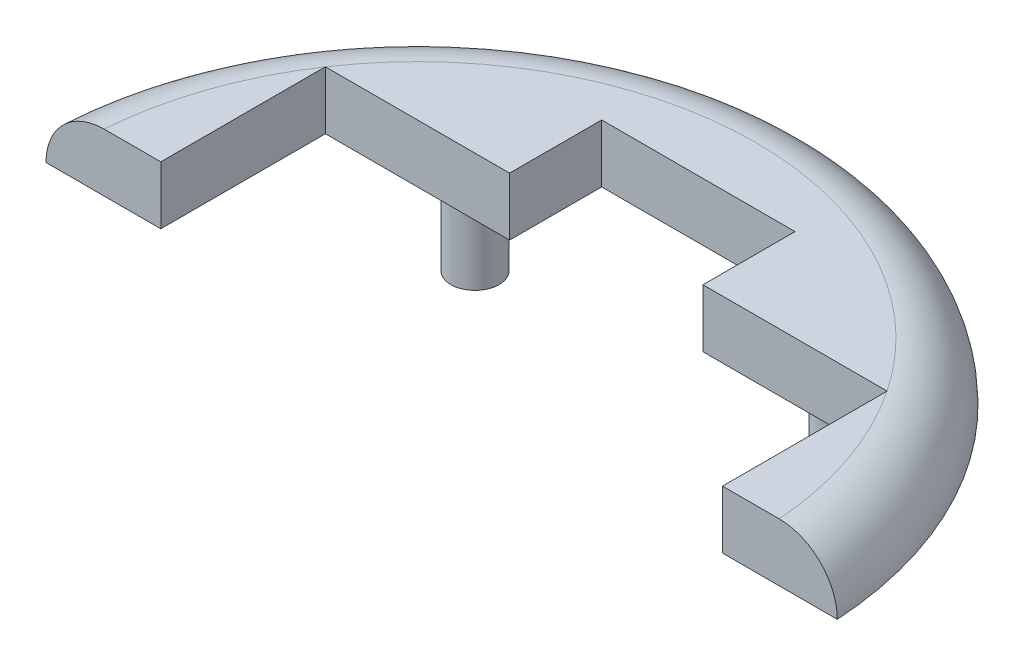
ISO-10303-21;
HEADER;
FILE_DESCRIPTION(('STEP AP214'),'2;1');
FILE_NAME('part.step','',(''),(''),'','','');
FILE_SCHEMA(('AUTOMOTIVE_DESIGN { 1 0 10303 214 1 1 1 1 }'));
ENDSEC;
DATA;
#1=APPLICATION_CONTEXT('core data for automotive mechanical design processes');
#2=APPLICATION_PROTOCOL_DEFINITION('international standard','automotive_design',2000,#1);
#3=PRODUCT_CONTEXT('',#1,'mechanical');
#4=PRODUCT('Part','Part','',(#3));
#5=PRODUCT_RELATED_PRODUCT_CATEGORY('part','',(#4));
#6=PRODUCT_DEFINITION_FORMATION('','',#4);
#7=PRODUCT_DEFINITION_CONTEXT('part definition',#1,'design');
#8=PRODUCT_DEFINITION('design','',#6,#7);
#9=PRODUCT_DEFINITION_SHAPE('','',#8);
#10=(LENGTH_UNIT() NAMED_UNIT(*) SI_UNIT(.MILLI.,.METRE.));
#11=(NAMED_UNIT(*) PLANE_ANGLE_UNIT() SI_UNIT($,.RADIAN.));
#12=(NAMED_UNIT(*) SI_UNIT($,.STERADIAN.) SOLID_ANGLE_UNIT());
#13=UNCERTAINTY_MEASURE_WITH_UNIT(LENGTH_MEASURE(1.E-05),#10,'distance_accuracy_value','');
#14=(GEOMETRIC_REPRESENTATION_CONTEXT(3) GLOBAL_UNCERTAINTY_ASSIGNED_CONTEXT((#13)) GLOBAL_UNIT_ASSIGNED_CONTEXT((#10,
#11,#12)) REPRESENTATION_CONTEXT('',''));
#15=CARTESIAN_POINT('',(0.,0.,0.));
#16=DIRECTION('',(0.,0.,1.));
#17=DIRECTION('',(1.,0.,0.));
#18=AXIS2_PLACEMENT_3D('',#15,#16,#17);
#19=CARTESIAN_POINT('',(0.,6.,0.));
#20=DIRECTION('',(0.,-1.,0.));
#21=DIRECTION('',(0.,0.,-1.));
#22=AXIS2_PLACEMENT_3D('',#19,#20,#21);
#23=PLANE('',#22);
#24=DIRECTION('',(1.,0.,0.));
#25=VECTOR('',#24,1.);
#26=CARTESIAN_POINT('',(40.9237095092808,6.,-2.5));
#27=LINE('',#26,#25);
#28=CARTESIAN_POINT('',(29.05,6.,-2.5));
#29=VERTEX_POINT('',#28);
#30=CARTESIAN_POINT('',(34.9106001094224,6.,-2.5));
#31=VERTEX_POINT('',#30);
#32=EDGE_CURVE('E168',#29,#31,#27,.T.);
#33=ORIENTED_EDGE('',*,*,#32,.T.);
#34=CARTESIAN_POINT('',(0.,6.,0.));
#35=DIRECTION('',(0.,-1.,0.));
#36=DIRECTION('',(0.,0.,-1.));
#37=AXIS2_PLACEMENT_3D('',#34,#35,#36);
#38=CIRCLE('',#37,35.);
#39=CARTESIAN_POINT('',(29.05,6.,-19.5217186743381));
#40=VERTEX_POINT('',#39);
#41=EDGE_CURVE('E213',#31,#40,#38,.F.);
#42=ORIENTED_EDGE('',*,*,#41,.T.);
#43=DIRECTION('',(0.,0.,1.));
#44=VECTOR('',#43,1.);
#45=CARTESIAN_POINT('',(29.05,6.,-2.5));
#46=LINE('',#45,#44);
#47=EDGE_CURVE('E166',#40,#29,#46,.T.);
#48=ORIENTED_EDGE('',*,*,#47,.T.);
#49=EDGE_LOOP('',(#33,#42,#48));
#50=FACE_BOUND('',#49,.T.);
#51=ADVANCED_FACE('F33',(#50),#23,.F.);
#52=DIRECTION('',(1.,0.,0.));
#53=VECTOR('',#52,1.);
#54=CARTESIAN_POINT('',(29.05,6.,-19.525));
#55=LINE('',#54,#53);
#56=CARTESIAN_POINT('',(10.,6.,-19.525));
#57=VERTEX_POINT('',#56);
#58=CARTESIAN_POINT('',(29.0477946667213,6.,-19.525));
#59=VERTEX_POINT('',#58);
#60=EDGE_CURVE('E163',#57,#59,#55,.T.);
#61=ORIENTED_EDGE('',*,*,#60,.T.);
#62=CARTESIAN_POINT('',(0.,6.,0.));
#63=DIRECTION('',(0.,-1.,0.));
#64=DIRECTION('',(0.,0.,-1.));
#65=AXIS2_PLACEMENT_3D('',#62,#63,#64);
#66=CIRCLE('',#65,35.);
#67=CARTESIAN_POINT('',(-29.0477946667212,6.,-19.525));
#68=VERTEX_POINT('',#67);
#69=EDGE_CURVE('E211',#59,#68,#66,.F.);
#70=ORIENTED_EDGE('',*,*,#69,.T.);
#71=DIRECTION('',(1.,0.,0.));
#72=VECTOR('',#71,1.);
#73=CARTESIAN_POINT('',(-10.,6.,-19.525));
#74=LINE('',#73,#72);
#75=CARTESIAN_POINT('',(-10.,6.,-19.525));
#76=VERTEX_POINT('',#75);
#77=EDGE_CURVE('E149',#68,#76,#74,.T.);
#78=ORIENTED_EDGE('',*,*,#77,.T.);
#79=DIRECTION('',(0.,0.,-1.));
#80=VECTOR('',#79,1.);
#81=CARTESIAN_POINT('',(-10.,6.,-29.05));
#82=LINE('',#81,#80);
#83=CARTESIAN_POINT('',(-10.,6.,-29.05));
#84=VERTEX_POINT('',#83);
#85=EDGE_CURVE('E156',#76,#84,#82,.T.);
#86=ORIENTED_EDGE('',*,*,#85,.T.);
#87=DIRECTION('',(1.,0.,0.));
#88=VECTOR('',#87,1.);
#89=CARTESIAN_POINT('',(10.,6.,-29.05));
#90=LINE('',#89,#88);
#91=CARTESIAN_POINT('',(10.,6.,-29.05));
#92=VERTEX_POINT('',#91);
#93=EDGE_CURVE('E158',#84,#92,#90,.T.);
#94=ORIENTED_EDGE('',*,*,#93,.T.);
#95=DIRECTION('',(0.,0.,1.));
#96=VECTOR('',#95,1.);
#97=CARTESIAN_POINT('',(10.,6.,-19.525));
#98=LINE('',#97,#96);
#99=EDGE_CURVE('E160',#92,#57,#98,.T.);
#100=ORIENTED_EDGE('',*,*,#99,.T.);
#101=EDGE_LOOP('',(#61,#70,#78,#86,#94,#100));
#102=FACE_BOUND('',#101,.T.);
#103=ADVANCED_FACE('F229',(#102),#23,.F.);
#104=CARTESIAN_POINT('',(-40.9237095092808,6.,-2.5));
#105=DIRECTION('',(0.,0.,-1.));
#106=DIRECTION('',(-1.,0.,0.));
#107=AXIS2_PLACEMENT_3D('',#104,#105,#106);
#108=PLANE('',#107);
#109=DIRECTION('',(1.,0.,0.));
#110=VECTOR('',#109,1.);
#111=CARTESIAN_POINT('',(-40.9237095092808,6.,-2.5));
#112=LINE('',#111,#110);
#113=CARTESIAN_POINT('',(-34.9106001094224,6.,-2.5));
#114=VERTEX_POINT('',#113);
#115=CARTESIAN_POINT('',(-29.05,6.,-2.5));
#116=VERTEX_POINT('',#115);
#117=EDGE_CURVE('E126',#114,#116,#112,.T.);
#118=ORIENTED_EDGE('',*,*,#117,.F.);
#119=CARTESIAN_POINT('',(-34.9106001094224,6.,-2.5));
#120=CARTESIAN_POINT('',(-35.0800179882929,6.00001797018295,-2.5));
#121=CARTESIAN_POINT('',(-35.2494336832572,5.9928617550382,-2.5));
#122=CARTESIAN_POINT('',(-35.5870566753661,5.96432730383787,-2.5));
#123=CARTESIAN_POINT('',(-35.7552640202545,5.94294963285177,-2.5));
#124=CARTESIAN_POINT('',(-36.0891672008,5.88611778897676,-2.5));
#125=CARTESIAN_POINT('',(-36.2548646551365,5.85067312777653,-2.5));
#126=CARTESIAN_POINT('',(-36.5826845879187,5.76595916081949,-2.5));
#127=CARTESIAN_POINT('',(-36.7448071169612,5.71669005085946,-2.5));
#128=CARTESIAN_POINT('',(-37.0643807867991,5.60464970885536,-2.5));
#129=CARTESIAN_POINT('',(-37.2218302926284,5.54187381306706,-2.5));
#130=CARTESIAN_POINT('',(-37.5309329973001,5.40324479398387,-2.5));
#131=CARTESIAN_POINT('',(-37.682584039163,5.32738686100436,-2.5));
#132=CARTESIAN_POINT('',(-37.9788608317051,5.16318960253427,-2.5));
#133=CARTESIAN_POINT('',(-38.1234904584548,5.07485727110241,-2.5));
#134=CARTESIAN_POINT('',(-38.4048286621699,4.88626966285092,-2.5));
#135=CARTESIAN_POINT('',(-38.5415344734195,4.78601025985342,-2.5));
#136=CARTESIAN_POINT('',(-38.8057828059783,4.57446840134053,-2.5));
#137=CARTESIAN_POINT('',(-38.9333393018911,4.46320340207344,-2.5));
#138=CARTESIAN_POINT('',(-39.1786092340384,4.23030748175573,-2.5));
#139=CARTESIAN_POINT('',(-39.2963226900089,4.10867658149048,-2.5));
#140=CARTESIAN_POINT('',(-39.5211033872014,3.85586455977837,-2.5));
#141=CARTESIAN_POINT('',(-39.6281666564116,3.7246799065966,-2.5));
#142=CARTESIAN_POINT('',(-39.8307912334343,3.45378132041483,-2.5));
#143=CARTESIAN_POINT('',(-39.9263565546816,3.31407038938447,-2.5));
#144=CARTESIAN_POINT('',(-40.1052030753096,3.02729301078446,-2.5));
#145=CARTESIAN_POINT('',(-40.1885028955557,2.88023817657385,-2.5));
#146=CARTESIAN_POINT('',(-40.342365783475,2.57967940741662,-2.5));
#147=CARTESIAN_POINT('',(-40.412933510642,2.4261778571957,-2.5));
#148=CARTESIAN_POINT('',(-40.5408429805404,2.11380871838092,-2.5));
#149=CARTESIAN_POINT('',(-40.5981887980583,1.95494280035191,-2.5));
#150=CARTESIAN_POINT('',(-40.6992549642066,1.63300078138544,-2.5));
#151=CARTESIAN_POINT('',(-40.7429786589001,1.46992572503149,-2.5));
#152=CARTESIAN_POINT('',(-40.8275657490682,1.09108137200387,-2.5));
#153=CARTESIAN_POINT('',(-40.8636185671392,0.874207524943266,-2.5));
#154=CARTESIAN_POINT('',(-40.8996689724679,0.547183080580897,-2.5));
#155=CARTESIAN_POINT('',(-40.9086809625199,0.437945385181208,-2.5));
#156=CARTESIAN_POINT('',(-40.9207005327296,0.219147244824673,-2.5));
#157=CARTESIAN_POINT('',(-40.9237085035704,0.109586821332472,-2.5));
#158=CARTESIAN_POINT('',(-40.9237095092808,0.,-2.5));
#159=B_SPLINE_CURVE_WITH_KNOTS('',3,(#119,#120,#121,#122,#123,#124,#125,#126,#127,#128,#129,
#130,#131,#132,#133,#134,#135,#136,#137,#138,#139,#140,#141,#142,#143,#144,#145,#146,#147,#148,
#149,#150,#151,#152,#153,#154,#155,#156,#157,#158),.UNSPECIFIED.,.F.,.F.,(4,2,2,2,2,2,2,2,2,2,2,
2,2,2,2,2,2,2,2,4),(0.,0.508099525865794,1.01617886431956,1.52391523806421,2.03164442106037,
2.53954919949851,3.04764111164478,3.55544927308924,4.06343362477902,4.57062479067096,
5.07781493958412,5.58519354257388,6.0923945247053,6.59881738005688,7.10505452503779,
7.61113544645497,8.11709195875391,8.77513696185111,9.10382486325526,9.43249137614971),.UNSPECIFIED.);
#160=CARTESIAN_POINT('',(-40.9237095092808,0.,-2.5));
#161=VERTEX_POINT('',#160);
#162=EDGE_CURVE('E215',#114,#161,#159,.T.);
#163=ORIENTED_EDGE('',*,*,#162,.T.);
#164=DIRECTION('',(1.,0.,0.));
#165=VECTOR('',#164,1.);
#166=CARTESIAN_POINT('',(-40.9237095092808,0.,-2.5));
#167=LINE('',#166,#165);
#168=CARTESIAN_POINT('',(-29.05,0.,-2.5));
#169=VERTEX_POINT('',#168);
#170=EDGE_CURVE('E142',#161,#169,#167,.T.);
#171=ORIENTED_EDGE('',*,*,#170,.T.);
#172=DIRECTION('',(0.,-1.,0.));
#173=VECTOR('',#172,1.);
#174=CARTESIAN_POINT('',(-29.05,6.,-2.5));
#175=LINE('',#174,#173);
#176=EDGE_CURVE('E139',#116,#169,#175,.T.);
#177=ORIENTED_EDGE('',*,*,#176,.F.);
#178=EDGE_LOOP('',(#118,#163,#171,#177));
#179=FACE_BOUND('',#178,.T.);
#180=ADVANCED_FACE('F140',(#179),#108,.F.);
#181=CARTESIAN_POINT('',(-29.05,6.,-19.525));
#182=DIRECTION('',(-1.,0.,0.));
#183=DIRECTION('',(0.,0.,1.));
#184=AXIS2_PLACEMENT_3D('',#181,#182,#183);
#185=PLANE('',#184);
#186=DIRECTION('',(0.,0.,-1.));
#187=VECTOR('',#186,1.);
#188=CARTESIAN_POINT('',(-29.05,0.,-19.525));
#189=LINE('',#188,#187);
#190=CARTESIAN_POINT('',(-29.05,0.,-19.525));
#191=VERTEX_POINT('',#190);
#192=EDGE_CURVE('E176',#169,#191,#189,.T.);
#193=ORIENTED_EDGE('',*,*,#192,.T.);
#194=DIRECTION('',(0.,-1.,0.));
#195=VECTOR('',#194,1.);
#196=CARTESIAN_POINT('',(-29.05,6.,-19.525));
#197=LINE('',#196,#195);
#198=CARTESIAN_POINT('',(-29.05,6.,-19.525));
#199=VERTEX_POINT('',#198);
#200=EDGE_CURVE('E145',#199,#191,#197,.T.);
#201=ORIENTED_EDGE('',*,*,#200,.F.);
#202=DIRECTION('',(0.,0.,-1.));
#203=VECTOR('',#202,1.);
#204=CARTESIAN_POINT('',(-29.05,6.,-19.525));
#205=LINE('',#204,#203);
#206=CARTESIAN_POINT('',(-29.05,6.,-19.5217186743381));
#207=VERTEX_POINT('',#206);
#208=EDGE_CURVE('E135',#207,#199,#205,.T.);
#209=ORIENTED_EDGE('',*,*,#208,.F.);
#210=EDGE_CURVE('E130',#116,#207,#205,.T.);
#211=ORIENTED_EDGE('',*,*,#210,.F.);
#212=ORIENTED_EDGE('',*,*,#176,.T.);
#213=EDGE_LOOP('',(#193,#201,#209,#211,#212));
#214=FACE_BOUND('',#213,.T.);
#215=ADVANCED_FACE('F147',(#214),#185,.F.);
#216=CARTESIAN_POINT('',(-10.,6.,-19.525));
#217=DIRECTION('',(0.,0.,-1.));
#218=DIRECTION('',(-1.,0.,0.));
#219=AXIS2_PLACEMENT_3D('',#216,#217,#218);
#220=PLANE('',#219);
#221=DIRECTION('',(1.,0.,0.));
#222=VECTOR('',#221,1.);
#223=CARTESIAN_POINT('',(-10.,0.,-19.525));
#224=LINE('',#223,#222);
#225=CARTESIAN_POINT('',(-10.,0.,-19.525));
#226=VERTEX_POINT('',#225);
#227=EDGE_CURVE('E178',#191,#226,#224,.T.);
#228=ORIENTED_EDGE('',*,*,#227,.T.);
#229=DIRECTION('',(0.,-1.,0.));
#230=VECTOR('',#229,1.);
#231=CARTESIAN_POINT('',(-10.,6.,-19.525));
#232=LINE('',#231,#230);
#233=EDGE_CURVE('E205',#76,#226,#232,.T.);
#234=ORIENTED_EDGE('',*,*,#233,.F.);
#235=ORIENTED_EDGE('',*,*,#77,.F.);
#236=EDGE_CURVE('E151',#199,#68,#74,.T.);
#237=ORIENTED_EDGE('',*,*,#236,.F.);
#238=ORIENTED_EDGE('',*,*,#200,.T.);
#239=EDGE_LOOP('',(#228,#234,#235,#237,#238));
#240=FACE_BOUND('',#239,.T.);
#241=ADVANCED_FACE('F232',(#240),#220,.F.);
#242=CARTESIAN_POINT('',(-10.,6.,-29.05));
#243=DIRECTION('',(-1.,0.,0.));
#244=DIRECTION('',(0.,0.,1.));
#245=AXIS2_PLACEMENT_3D('',#242,#243,#244);
#246=PLANE('',#245);
#247=DIRECTION('',(0.,0.,-1.));
#248=VECTOR('',#247,1.);
#249=CARTESIAN_POINT('',(-10.,0.,-29.05));
#250=LINE('',#249,#248);
#251=CARTESIAN_POINT('',(-10.,0.,-29.05));
#252=VERTEX_POINT('',#251);
#253=EDGE_CURVE('E180',#226,#252,#250,.T.);
#254=ORIENTED_EDGE('',*,*,#253,.T.);
#255=DIRECTION('',(0.,-1.,0.));
#256=VECTOR('',#255,1.);
#257=CARTESIAN_POINT('',(-10.,6.,-29.05));
#258=LINE('',#257,#256);
#259=EDGE_CURVE('E202',#84,#252,#258,.T.);
#260=ORIENTED_EDGE('',*,*,#259,.F.);
#261=ORIENTED_EDGE('',*,*,#85,.F.);
#262=ORIENTED_EDGE('',*,*,#233,.T.);
#263=EDGE_LOOP('',(#254,#260,#261,#262));
#264=FACE_BOUND('',#263,.T.);
#265=ADVANCED_FACE('F235',(#264),#246,.F.);
#266=CARTESIAN_POINT('',(10.,6.,-29.05));
#267=DIRECTION('',(0.,0.,-1.));
#268=DIRECTION('',(-1.,0.,0.));
#269=AXIS2_PLACEMENT_3D('',#266,#267,#268);
#270=PLANE('',#269);
#271=DIRECTION('',(1.,0.,0.));
#272=VECTOR('',#271,1.);
#273=CARTESIAN_POINT('',(10.,0.,-29.05));
#274=LINE('',#273,#272);
#275=CARTESIAN_POINT('',(10.,0.,-29.05));
#276=VERTEX_POINT('',#275);
#277=EDGE_CURVE('E182',#252,#276,#274,.T.);
#278=ORIENTED_EDGE('',*,*,#277,.T.);
#279=DIRECTION('',(0.,-1.,0.));
#280=VECTOR('',#279,1.);
#281=CARTESIAN_POINT('',(10.,6.,-29.05));
#282=LINE('',#281,#280);
#283=EDGE_CURVE('E199',#92,#276,#282,.T.);
#284=ORIENTED_EDGE('',*,*,#283,.F.);
#285=ORIENTED_EDGE('',*,*,#93,.F.);
#286=ORIENTED_EDGE('',*,*,#259,.T.);
#287=EDGE_LOOP('',(#278,#284,#285,#286));
#288=FACE_BOUND('',#287,.T.);
#289=ADVANCED_FACE('F239',(#288),#270,.F.);
#290=CARTESIAN_POINT('',(10.,6.,-19.525));
#291=DIRECTION('',(1.,0.,0.));
#292=DIRECTION('',(0.,0.,-1.));
#293=AXIS2_PLACEMENT_3D('',#290,#291,#292);
#294=PLANE('',#293);
#295=DIRECTION('',(0.,0.,1.));
#296=VECTOR('',#295,1.);
#297=CARTESIAN_POINT('',(10.,0.,-19.525));
#298=LINE('',#297,#296);
#299=CARTESIAN_POINT('',(10.,0.,-19.525));
#300=VERTEX_POINT('',#299);
#301=EDGE_CURVE('E184',#276,#300,#298,.T.);
#302=ORIENTED_EDGE('',*,*,#301,.T.);
#303=DIRECTION('',(0.,-1.,0.));
#304=VECTOR('',#303,1.);
#305=CARTESIAN_POINT('',(10.,6.,-19.525));
#306=LINE('',#305,#304);
#307=EDGE_CURVE('E196',#57,#300,#306,.T.);
#308=ORIENTED_EDGE('',*,*,#307,.F.);
#309=ORIENTED_EDGE('',*,*,#99,.F.);
#310=ORIENTED_EDGE('',*,*,#283,.T.);
#311=EDGE_LOOP('',(#302,#308,#309,#310));
#312=FACE_BOUND('',#311,.T.);
#313=ADVANCED_FACE('F243',(#312),#294,.F.);
#314=CARTESIAN_POINT('',(29.05,6.,-19.525));
#315=DIRECTION('',(0.,0.,-1.));
#316=DIRECTION('',(-1.,0.,0.));
#317=AXIS2_PLACEMENT_3D('',#314,#315,#316);
#318=PLANE('',#317);
#319=DIRECTION('',(1.,0.,0.));
#320=VECTOR('',#319,1.);
#321=CARTESIAN_POINT('',(29.05,0.,-19.525));
#322=LINE('',#321,#320);
#323=CARTESIAN_POINT('',(29.05,0.,-19.525));
#324=VERTEX_POINT('',#323);
#325=EDGE_CURVE('E186',#300,#324,#322,.T.);
#326=ORIENTED_EDGE('',*,*,#325,.T.);
#327=DIRECTION('',(0.,-1.,0.));
#328=VECTOR('',#327,1.);
#329=CARTESIAN_POINT('',(29.05,6.,-19.525));
#330=LINE('',#329,#328);
#331=CARTESIAN_POINT('',(29.05,6.,-19.525));
#332=VERTEX_POINT('',#331);
#333=EDGE_CURVE('E193',#332,#324,#330,.T.);
#334=ORIENTED_EDGE('',*,*,#333,.F.);
#335=EDGE_CURVE('E162',#59,#332,#55,.T.);
#336=ORIENTED_EDGE('',*,*,#335,.F.);
#337=ORIENTED_EDGE('',*,*,#60,.F.);
#338=ORIENTED_EDGE('',*,*,#307,.T.);
#339=EDGE_LOOP('',(#326,#334,#336,#337,#338));
#340=FACE_BOUND('',#339,.T.);
#341=ADVANCED_FACE('F247',(#340),#318,.F.);
#342=CARTESIAN_POINT('',(29.05,6.,-2.5));
#343=DIRECTION('',(1.,0.,0.));
#344=DIRECTION('',(0.,0.,-1.));
#345=AXIS2_PLACEMENT_3D('',#342,#343,#344);
#346=PLANE('',#345);
#347=DIRECTION('',(0.,0.,1.));
#348=VECTOR('',#347,1.);
#349=CARTESIAN_POINT('',(29.05,0.,-2.5));
#350=LINE('',#349,#348);
#351=CARTESIAN_POINT('',(29.05,0.,-2.5));
#352=VERTEX_POINT('',#351);
#353=EDGE_CURVE('E188',#324,#352,#350,.T.);
#354=ORIENTED_EDGE('',*,*,#353,.T.);
#355=DIRECTION('',(0.,-1.,0.));
#356=VECTOR('',#355,1.);
#357=CARTESIAN_POINT('',(29.05,6.,-2.5));
#358=LINE('',#357,#356);
#359=EDGE_CURVE('E170',#29,#352,#358,.T.);
#360=ORIENTED_EDGE('',*,*,#359,.F.);
#361=ORIENTED_EDGE('',*,*,#47,.F.);
#362=EDGE_CURVE('E57',#332,#40,#46,.T.);
#363=ORIENTED_EDGE('',*,*,#362,.F.);
#364=ORIENTED_EDGE('',*,*,#333,.T.);
#365=EDGE_LOOP('',(#354,#360,#361,#363,#364));
#366=FACE_BOUND('',#365,.T.);
#367=ADVANCED_FACE('F251',(#366),#346,.F.);
#368=CARTESIAN_POINT('',(40.9237095092808,6.,-2.5));
#369=DIRECTION('',(0.,0.,-1.));
#370=DIRECTION('',(-1.,0.,0.));
#371=AXIS2_PLACEMENT_3D('',#368,#369,#370);
#372=PLANE('',#371);
#373=DIRECTION('',(1.,0.,0.));
#374=VECTOR('',#373,1.);
#375=CARTESIAN_POINT('',(40.9237095092808,0.,-2.5));
#376=LINE('',#375,#374);
#377=CARTESIAN_POINT('',(40.9237095092808,0.,-2.5));
#378=VERTEX_POINT('',#377);
#379=EDGE_CURVE('E136',#352,#378,#376,.T.);
#380=ORIENTED_EDGE('',*,*,#379,.T.);
#381=CARTESIAN_POINT('',(40.9237095092808,0.,-2.5));
#382=CARTESIAN_POINT('',(40.9237278216039,0.1685178725476,-2.5));
#383=CARTESIAN_POINT('',(40.9165974765413,0.33703304225152,-2.5));
#384=CARTESIAN_POINT('',(40.8881717895351,0.672856156919677,-2.5));
#385=CARTESIAN_POINT('',(40.8668771726662,0.840164163235956,-2.5));
#386=CARTESIAN_POINT('',(40.8102779729104,1.17225521428295,-2.5));
#387=CARTESIAN_POINT('',(40.7749846559244,1.33704017902427,-2.5));
#388=CARTESIAN_POINT('',(40.6906472368231,1.66305058865522,-2.5));
#389=CARTESIAN_POINT('',(40.6416032943122,1.82427607483651,-2.5));
#390=CARTESIAN_POINT('',(40.5300984923907,2.14207047141376,-2.5));
#391=CARTESIAN_POINT('',(40.4676337988165,2.29863803650914,-2.5));
#392=CARTESIAN_POINT('',(40.3297183569953,2.60601440527306,-2.5));
#393=CARTESIAN_POINT('',(40.2542628347779,2.75682106689774,-2.5));
#394=CARTESIAN_POINT('',(40.090964760547,3.0514683601167,-2.5));
#395=CARTESIAN_POINT('',(40.0031287020198,3.19531259065292,-2.5));
#396=CARTESIAN_POINT('',(39.81563497107,3.47515090239466,-2.5));
#397=CARTESIAN_POINT('',(39.7159731944274,3.6111422336956,-2.5));
#398=CARTESIAN_POINT('',(39.5055051026169,3.87433386531818,-2.5));
#399=CARTESIAN_POINT('',(39.3946925605393,4.00152918605468,-2.5));
#400=CARTESIAN_POINT('',(39.1627605333481,4.24614750966031,-2.5));
#401=CARTESIAN_POINT('',(39.041641028659,4.36357049396851,-2.5));
#402=CARTESIAN_POINT('',(38.7899122708075,4.5878582691919,-2.5));
#403=CARTESIAN_POINT('',(38.6592995616403,4.69471918123202,-2.5));
#404=CARTESIAN_POINT('',(38.3896002183965,4.89704804976446,-2.5));
#405=CARTESIAN_POINT('',(38.2505165124172,4.9925199096302,-2.5));
#406=CARTESIAN_POINT('',(37.9644877895384,5.17165379245415,-2.5));
#407=CARTESIAN_POINT('',(37.8175251776501,5.25528772376344,-2.5));
#408=CARTESIAN_POINT('',(37.5171403569025,5.40986560784158,-2.5));
#409=CARTESIAN_POINT('',(37.3637204921865,5.48081411747481,-2.5));
#410=CARTESIAN_POINT('',(37.0514929775787,5.60954676239761,-2.5));
#411=CARTESIAN_POINT('',(36.8926867099983,5.66733424626671,-2.5));
#412=CARTESIAN_POINT('',(36.5708435143871,5.76935141273479,-2.5));
#413=CARTESIAN_POINT('',(36.4078075863269,5.81358426878316,-2.5));
#414=CARTESIAN_POINT('',(36.0246128758776,5.90042786825471,-2.5));
#415=CARTESIAN_POINT('',(35.8032243988928,5.937768407856,-2.5));
#416=CARTESIAN_POINT('',(35.4693385044089,5.97510430920544,-2.5));
#417=CARTESIAN_POINT('',(35.3577992070453,5.98443711789794,-2.5));
#418=CARTESIAN_POINT('',(35.1343826157527,5.99688413465124,-2.5));
#419=CARTESIAN_POINT('',(35.0225053481457,5.99999881509948,-2.5));
#420=CARTESIAN_POINT('',(34.9106001094224,6.,-2.5));
#421=B_SPLINE_CURVE_WITH_KNOTS('',3,(#381,#382,#383,#384,#385,#386,#387,#388,#389,#390,#391,
#392,#393,#394,#395,#396,#397,#398,#399,#400,#401,#402,#403,#404,#405,#406,#407,#408,#409,#410,
#411,#412,#413,#414,#415,#416,#417,#418,#419,#420),.UNSPECIFIED.,.F.,.F.,(4,2,2,2,2,2,2,2,2,2,2,
2,2,2,2,2,2,2,2,4),(0.,0.505399005280253,1.01077214097528,1.51573938405979,2.02070076620141,
2.52580660263348,3.03109845702832,3.53612626953278,4.04132987189454,4.54681717689786,
5.05230544196896,5.55797866097836,6.06347806946794,6.5701576188536,7.07665479124049,
7.58302295046586,8.08927246655055,8.76123117126683,9.096873193572,9.43248971638488),.UNSPECIFIED.);
#422=EDGE_CURVE('E49',#378,#31,#421,.T.);
#423=ORIENTED_EDGE('',*,*,#422,.T.);
#424=ORIENTED_EDGE('',*,*,#32,.F.);
#425=ORIENTED_EDGE('',*,*,#359,.T.);
#426=EDGE_LOOP('',(#380,#423,#424,#425));
#427=FACE_BOUND('',#426,.T.);
#428=ADVANCED_FACE('F254',(#427),#372,.F.);
#429=ORIENTED_EDGE('',*,*,#210,.T.);
#430=CARTESIAN_POINT('',(0.,6.,0.));
#431=DIRECTION('',(0.,-1.,0.));
#432=DIRECTION('',(0.,0.,-1.));
#433=AXIS2_PLACEMENT_3D('',#430,#431,#432);
#434=CIRCLE('',#433,35.);
#435=EDGE_CURVE('E132',#207,#114,#434,.F.);
#436=ORIENTED_EDGE('',*,*,#435,.T.);
#437=ORIENTED_EDGE('',*,*,#117,.T.);
#438=EDGE_LOOP('',(#429,#436,#437));
#439=FACE_BOUND('',#438,.T.);
#440=ADVANCED_FACE('F128',(#439),#23,.F.);
#441=CARTESIAN_POINT('',(0.,0.,0.));
#442=DIRECTION('',(0.,-1.,0.));
#443=DIRECTION('',(0.,0.,-1.));
#444=AXIS2_PLACEMENT_3D('',#441,#442,#443);
#445=PLANE('',#444);
#446=CARTESIAN_POINT('',(-19.05,0.,-25.));
#447=DIRECTION('',(0.,-1.,0.));
#448=DIRECTION('',(0.,0.,-1.));
#449=AXIS2_PLACEMENT_3D('',#446,#447,#448);
#450=CIRCLE('',#449,2.5);
#451=CARTESIAN_POINT('',(-19.05,0.,-27.5));
#452=VERTEX_POINT('',#451);
#453=EDGE_CURVE('E462',#452,#452,#450,.T.);
#454=ORIENTED_EDGE('',*,*,#453,.F.);
#455=EDGE_LOOP('',(#454));
#456=FACE_BOUND('',#455,.T.);
#457=CARTESIAN_POINT('',(19.05,0.,-25.));
#458=DIRECTION('',(0.,-1.,0.));
#459=DIRECTION('',(0.,0.,-1.));
#460=AXIS2_PLACEMENT_3D('',#457,#458,#459);
#461=CIRCLE('',#460,2.5);
#462=CARTESIAN_POINT('',(19.05,0.,-27.5));
#463=VERTEX_POINT('',#462);
#464=EDGE_CURVE('E473',#463,#463,#461,.T.);
#465=ORIENTED_EDGE('',*,*,#464,.F.);
#466=EDGE_LOOP('',(#465));
#467=FACE_BOUND('',#466,.T.);
#468=CARTESIAN_POINT('',(0.,0.,0.));
#469=DIRECTION('',(0.,1.,0.));
#470=DIRECTION('',(0.,0.,-1.));
#471=AXIS2_PLACEMENT_3D('',#468,#469,#470);
#472=CIRCLE('',#471,41.);
#473=EDGE_CURVE('E171',#378,#161,#472,.T.);
#474=ORIENTED_EDGE('',*,*,#473,.F.);
#475=ORIENTED_EDGE('',*,*,#379,.F.);
#476=ORIENTED_EDGE('',*,*,#353,.F.);
#477=ORIENTED_EDGE('',*,*,#325,.F.);
#478=ORIENTED_EDGE('',*,*,#301,.F.);
#479=ORIENTED_EDGE('',*,*,#277,.F.);
#480=ORIENTED_EDGE('',*,*,#253,.F.);
#481=ORIENTED_EDGE('',*,*,#227,.F.);
#482=ORIENTED_EDGE('',*,*,#192,.F.);
#483=ORIENTED_EDGE('',*,*,#170,.F.);
#484=EDGE_LOOP('',(#474,#475,#476,#477,#478,#479,#480,#481,#482,#483));
#485=FACE_BOUND('',#484,.T.);
#486=ADVANCED_FACE('F259',(#456,#467,#485),#445,.T.);
#487=CARTESIAN_POINT('',(0.,0.,0.));
#488=DIRECTION('',(0.,-1.,0.));
#489=DIRECTION('',(0.,0.,-1.));
#490=AXIS2_PLACEMENT_3D('',#487,#488,#489);
#491=TOROIDAL_SURFACE('',#490,35.,6.);
#492=ORIENTED_EDGE('',*,*,#422,.F.);
#493=ORIENTED_EDGE('',*,*,#473,.T.);
#494=ORIENTED_EDGE('',*,*,#162,.F.);
#495=ORIENTED_EDGE('',*,*,#435,.F.);
#496=ORIENTED_EDGE('',*,*,#208,.T.);
#497=ORIENTED_EDGE('',*,*,#236,.T.);
#498=ORIENTED_EDGE('',*,*,#69,.F.);
#499=ORIENTED_EDGE('',*,*,#335,.T.);
#500=ORIENTED_EDGE('',*,*,#362,.T.);
#501=ORIENTED_EDGE('',*,*,#41,.F.);
#502=EDGE_LOOP('',(#492,#493,#494,#495,#496,#497,#498,#499,#500,#501));
#503=FACE_BOUND('',#502,.T.);
#504=ADVANCED_FACE('F35',(#503),#491,.T.);
#505=CARTESIAN_POINT('',(19.05,-10.,-25.));
#506=DIRECTION('',(0.,-1.,0.));
#507=DIRECTION('',(0.,0.,-1.));
#508=AXIS2_PLACEMENT_3D('',#505,#506,#507);
#509=PLANE('',#508);
#510=CARTESIAN_POINT('',(19.05,-10.,-25.));
#511=DIRECTION('',(0.,-1.,0.));
#512=DIRECTION('',(0.,0.,-1.));
#513=AXIS2_PLACEMENT_3D('',#510,#511,#512);
#514=CIRCLE('',#513,2.5);
#515=CARTESIAN_POINT('',(19.05,-10.,-27.5));
#516=VERTEX_POINT('',#515);
#517=EDGE_CURVE('E174',#516,#516,#514,.T.);
#518=ORIENTED_EDGE('',*,*,#517,.T.);
#519=EDGE_LOOP('',(#518));
#520=FACE_BOUND('',#519,.T.);
#521=CARTESIAN_POINT('',(19.05,-10.,-25.));
#522=DIRECTION('',(0.,-1.,0.));
#523=DIRECTION('',(0.,0.,-1.));
#524=AXIS2_PLACEMENT_3D('',#521,#522,#523);
#525=CIRCLE('',#524,0.799999999999999);
#526=CARTESIAN_POINT('',(19.05,-10.,-25.8));
#527=VERTEX_POINT('',#526);
#528=EDGE_CURVE('E469',#527,#527,#525,.T.);
#529=ORIENTED_EDGE('',*,*,#528,.F.);
#530=EDGE_LOOP('',(#529));
#531=FACE_BOUND('',#530,.T.);
#532=ADVANCED_FACE('F271',(#520,#531),#509,.T.);
#533=CARTESIAN_POINT('',(19.05,-10.,-25.));
#534=DIRECTION('',(0.,1.,0.));
#535=DIRECTION('',(0.,0.,1.));
#536=AXIS2_PLACEMENT_3D('',#533,#534,#535);
#537=CYLINDRICAL_SURFACE('',#536,2.5);
#538=ORIENTED_EDGE('',*,*,#517,.F.);
#539=EDGE_LOOP('',(#538));
#540=FACE_BOUND('',#539,.T.);
#541=ORIENTED_EDGE('',*,*,#464,.T.);
#542=EDGE_LOOP('',(#541));
#543=FACE_BOUND('',#542,.T.);
#544=ADVANCED_FACE('F267',(#540,#543),#537,.T.);
#545=CARTESIAN_POINT('',(19.05,-10.,-25.));
#546=DIRECTION('',(0.,1.,0.));
#547=DIRECTION('',(0.,0.,1.));
#548=AXIS2_PLACEMENT_3D('',#545,#546,#547);
#549=CYLINDRICAL_SURFACE('',#548,0.799999999999999);
#550=ORIENTED_EDGE('',*,*,#528,.T.);
#551=EDGE_LOOP('',(#550));
#552=FACE_BOUND('',#551,.T.);
#553=CARTESIAN_POINT('',(19.05,0.,-25.));
#554=DIRECTION('',(0.,-1.,0.));
#555=DIRECTION('',(0.,0.,-1.));
#556=AXIS2_PLACEMENT_3D('',#553,#554,#555);
#557=CIRCLE('',#556,0.799999999999999);
#558=CARTESIAN_POINT('',(19.05,0.,-25.8));
#559=VERTEX_POINT('',#558);
#560=EDGE_CURVE('E42',#559,#559,#557,.F.);
#561=ORIENTED_EDGE('',*,*,#560,.T.);
#562=EDGE_LOOP('',(#561));
#563=FACE_BOUND('',#562,.T.);
#564=ADVANCED_FACE('F270',(#552,#563),#549,.F.);
#565=ORIENTED_EDGE('',*,*,#560,.F.);
#566=EDGE_LOOP('',(#565));
#567=FACE_BOUND('',#566,.T.);
#568=ADVANCED_FACE('F264',(#567),#445,.T.);
#569=CARTESIAN_POINT('',(-19.05,-10.,-25.));
#570=DIRECTION('',(0.,-1.,0.));
#571=DIRECTION('',(0.,0.,-1.));
#572=AXIS2_PLACEMENT_3D('',#569,#570,#571);
#573=PLANE('',#572);
#574=CARTESIAN_POINT('',(-19.05,-10.,-25.));
#575=DIRECTION('',(0.,-1.,0.));
#576=DIRECTION('',(0.,0.,-1.));
#577=AXIS2_PLACEMENT_3D('',#574,#575,#576);
#578=CIRCLE('',#577,2.5);
#579=CARTESIAN_POINT('',(-19.05,-10.,-27.5));
#580=VERTEX_POINT('',#579);
#581=EDGE_CURVE('E465',#580,#580,#578,.T.);
#582=ORIENTED_EDGE('',*,*,#581,.T.);
#583=EDGE_LOOP('',(#582));
#584=FACE_BOUND('',#583,.T.);
#585=CARTESIAN_POINT('',(-19.05,-10.,-25.));
#586=DIRECTION('',(0.,-1.,0.));
#587=DIRECTION('',(0.,0.,-1.));
#588=AXIS2_PLACEMENT_3D('',#585,#586,#587);
#589=CIRCLE('',#588,0.799999999999999);
#590=CARTESIAN_POINT('',(-19.05,-10.,-25.8));
#591=VERTEX_POINT('',#590);
#592=EDGE_CURVE('E459',#591,#591,#589,.T.);
#593=ORIENTED_EDGE('',*,*,#592,.F.);
#594=EDGE_LOOP('',(#593));
#595=FACE_BOUND('',#594,.T.);
#596=ADVANCED_FACE('F283',(#584,#595),#573,.T.);
#597=CARTESIAN_POINT('',(-19.05,-10.,-25.));
#598=DIRECTION('',(0.,1.,0.));
#599=DIRECTION('',(0.,0.,1.));
#600=AXIS2_PLACEMENT_3D('',#597,#598,#599);
#601=CYLINDRICAL_SURFACE('',#600,2.5);
#602=ORIENTED_EDGE('',*,*,#581,.F.);
#603=EDGE_LOOP('',(#602));
#604=FACE_BOUND('',#603,.T.);
#605=ORIENTED_EDGE('',*,*,#453,.T.);
#606=EDGE_LOOP('',(#605));
#607=FACE_BOUND('',#606,.T.);
#608=ADVANCED_FACE('F279',(#604,#607),#601,.T.);
#609=CARTESIAN_POINT('',(-19.05,-10.,-25.));
#610=DIRECTION('',(0.,1.,0.));
#611=DIRECTION('',(0.,0.,1.));
#612=AXIS2_PLACEMENT_3D('',#609,#610,#611);
#613=CYLINDRICAL_SURFACE('',#612,0.799999999999999);
#614=ORIENTED_EDGE('',*,*,#592,.T.);
#615=EDGE_LOOP('',(#614));
#616=FACE_BOUND('',#615,.T.);
#617=CARTESIAN_POINT('',(-19.05,0.,-25.));
#618=DIRECTION('',(0.,-1.,0.));
#619=DIRECTION('',(0.,0.,-1.));
#620=AXIS2_PLACEMENT_3D('',#617,#618,#619);
#621=CIRCLE('',#620,0.799999999999999);
#622=CARTESIAN_POINT('',(-19.05,0.,-25.8));
#623=VERTEX_POINT('',#622);
#624=EDGE_CURVE('E11',#623,#623,#621,.F.);
#625=ORIENTED_EDGE('',*,*,#624,.T.);
#626=EDGE_LOOP('',(#625));
#627=FACE_BOUND('',#626,.T.);
#628=ADVANCED_FACE('F282',(#616,#627),#613,.F.);
#629=ORIENTED_EDGE('',*,*,#624,.F.);
#630=EDGE_LOOP('',(#629));
#631=FACE_BOUND('',#630,.T.);
#632=ADVANCED_FACE('F263',(#631),#445,.T.);
#633=CLOSED_SHELL('',(#51,#103,#180,#215,#241,#265,#289,#313,#341,#367,#428,#440,#486,#504,#532,
#544,#564,#568,#596,#608,#628,#632));
#634=MANIFOLD_SOLID_BREP('B2',#633);
#635=ADVANCED_BREP_SHAPE_REPRESENTATION('',(#18,#634),#14);
#636=SHAPE_DEFINITION_REPRESENTATION(#9,#635);
ENDSEC;
END-ISO-10303-21;
